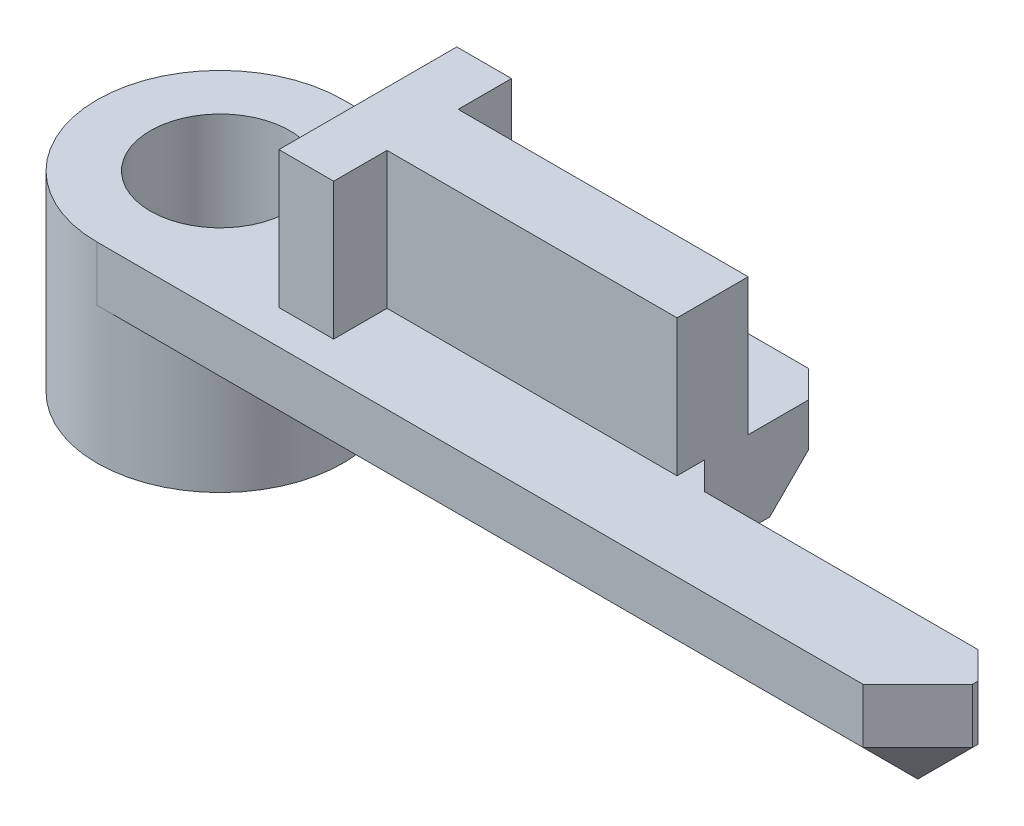
ISO-10303-21;
HEADER;
FILE_DESCRIPTION(('STEP AP214'),'2;1');
FILE_NAME('part.step','',(''),(''),'','','');
FILE_SCHEMA(('AUTOMOTIVE_DESIGN { 1 0 10303 214 1 1 1 1 }'));
ENDSEC;
DATA;
#1=APPLICATION_CONTEXT('core data for automotive mechanical design processes');
#2=APPLICATION_PROTOCOL_DEFINITION('international standard','automotive_design',2000,#1);
#3=PRODUCT_CONTEXT('',#1,'mechanical');
#4=PRODUCT('Part','Part','',(#3));
#5=PRODUCT_RELATED_PRODUCT_CATEGORY('part','',(#4));
#6=PRODUCT_DEFINITION_FORMATION('','',#4);
#7=PRODUCT_DEFINITION_CONTEXT('part definition',#1,'design');
#8=PRODUCT_DEFINITION('design','',#6,#7);
#9=PRODUCT_DEFINITION_SHAPE('','',#8);
#10=(LENGTH_UNIT() NAMED_UNIT(*) SI_UNIT(.MILLI.,.METRE.));
#11=(NAMED_UNIT(*) PLANE_ANGLE_UNIT() SI_UNIT($,.RADIAN.));
#12=(NAMED_UNIT(*) SI_UNIT($,.STERADIAN.) SOLID_ANGLE_UNIT());
#13=UNCERTAINTY_MEASURE_WITH_UNIT(LENGTH_MEASURE(1.E-05),#10,'distance_accuracy_value','');
#14=(GEOMETRIC_REPRESENTATION_CONTEXT(3) GLOBAL_UNCERTAINTY_ASSIGNED_CONTEXT((#13)) GLOBAL_UNIT_ASSIGNED_CONTEXT((#10,
#11,#12)) REPRESENTATION_CONTEXT('',''));
#15=CARTESIAN_POINT('',(0.,0.,0.));
#16=DIRECTION('',(0.,0.,1.));
#17=DIRECTION('',(1.,0.,0.));
#18=AXIS2_PLACEMENT_3D('',#15,#16,#17);
#19=CARTESIAN_POINT('',(0.,3.,0.));
#20=DIRECTION('',(0.,1.,0.));
#21=DIRECTION('',(0.,0.,1.));
#22=AXIS2_PLACEMENT_3D('',#19,#20,#21);
#23=PLANE('',#22);
#24=DIRECTION('',(1.,0.,0.));
#25=VECTOR('',#24,1.);
#26=CARTESIAN_POINT('',(0.,3.,-2.5));
#27=LINE('',#26,#25);
#28=CARTESIAN_POINT('',(3.74165738677394,3.,-2.5));
#29=VERTEX_POINT('',#28);
#30=CARTESIAN_POINT('',(17.,3.,-2.5));
#31=VERTEX_POINT('',#30);
#32=EDGE_CURVE('E354',#29,#31,#27,.T.);
#33=ORIENTED_EDGE('',*,*,#32,.T.);
#34=DIRECTION('',(0.,0.,1.));
#35=VECTOR('',#34,1.);
#36=CARTESIAN_POINT('',(17.,3.,1.3));
#37=LINE('',#36,#35);
#38=CARTESIAN_POINT('',(17.,3.,0.300000000000006));
#39=VERTEX_POINT('',#38);
#40=EDGE_CURVE('E430',#31,#39,#37,.T.);
#41=ORIENTED_EDGE('',*,*,#40,.T.);
#42=DIRECTION('',(-0.707106781186552,0.,-0.707106781186543));
#43=VECTOR('',#42,1.);
#44=CARTESIAN_POINT('',(17.,3.,0.300000000000007));
#45=LINE('',#44,#43);
#46=CARTESIAN_POINT('',(18.,3.,1.3));
#47=VERTEX_POINT('',#46);
#48=EDGE_CURVE('E426',#47,#39,#45,.T.);
#49=ORIENTED_EDGE('',*,*,#48,.F.);
#50=DIRECTION('',(-0.707106781186552,0.,-0.707106781186543));
#51=VECTOR('',#50,1.);
#52=CARTESIAN_POINT('',(17.,3.,0.300000000000007));
#53=LINE('',#52,#51);
#54=CARTESIAN_POINT('',(19.,3.,2.29999999999999));
#55=VERTEX_POINT('',#54);
#56=EDGE_CURVE('E422',#55,#47,#53,.T.);
#57=ORIENTED_EDGE('',*,*,#56,.F.);
#58=DIRECTION('',(1.,0.,0.));
#59=VECTOR('',#58,1.);
#60=CARTESIAN_POINT('',(28.,3.,2.29999999999999));
#61=LINE('',#60,#59);
#62=CARTESIAN_POINT('',(28.,3.,2.29999999999999));
#63=VERTEX_POINT('',#62);
#64=EDGE_CURVE('E419',#55,#63,#61,.T.);
#65=ORIENTED_EDGE('',*,*,#64,.T.);
#66=DIRECTION('',(0.,0.,1.));
#67=VECTOR('',#66,1.);
#68=CARTESIAN_POINT('',(28.,3.,0.));
#69=LINE('',#68,#67);
#70=CARTESIAN_POINT('',(28.,3.,2.5));
#71=VERTEX_POINT('',#70);
#72=EDGE_CURVE('E358',#63,#71,#69,.T.);
#73=ORIENTED_EDGE('',*,*,#72,.T.);
#74=DIRECTION('',(-1.,0.,0.));
#75=VECTOR('',#74,1.);
#76=CARTESIAN_POINT('',(0.,3.,2.5));
#77=LINE('',#76,#75);
#78=CARTESIAN_POINT('',(3.74165738677394,3.,2.5));
#79=VERTEX_POINT('',#78);
#80=EDGE_CURVE('E361',#71,#79,#77,.T.);
#81=ORIENTED_EDGE('',*,*,#80,.T.);
#82=CARTESIAN_POINT('',(0.,3.,0.));
#83=DIRECTION('',(0.,1.,0.));
#84=DIRECTION('',(0.,0.,1.));
#85=AXIS2_PLACEMENT_3D('',#82,#83,#84);
#86=CIRCLE('',#85,4.5);
#87=EDGE_CURVE('E340',#79,#29,#86,.T.);
#88=ORIENTED_EDGE('',*,*,#87,.T.);
#89=EDGE_LOOP('',(#33,#41,#49,#57,#65,#73,#81,#88));
#90=FACE_BOUND('',#89,.T.);
#91=ADVANCED_FACE('F45',(#90),#23,.F.);
#92=CARTESIAN_POINT('',(0.,6.99999999999999,0.));
#93=DIRECTION('',(0.,1.,0.));
#94=DIRECTION('',(0.,0.,1.));
#95=AXIS2_PLACEMENT_3D('',#92,#93,#94);
#96=PLANE('',#95);
#97=CARTESIAN_POINT('',(0.,6.99999999999999,0.));
#98=DIRECTION('',(0.,1.,0.));
#99=DIRECTION('',(0.,0.,1.));
#100=AXIS2_PLACEMENT_3D('',#97,#98,#99);
#101=CIRCLE('',#100,2.55);
#102=CARTESIAN_POINT('',(0.,6.99999999999999,2.55));
#103=VERTEX_POINT('',#102);
#104=EDGE_CURVE('E307',#103,#103,#101,.T.);
#105=ORIENTED_EDGE('',*,*,#104,.F.);
#106=EDGE_LOOP('',(#105));
#107=FACE_BOUND('',#106,.T.);
#108=DIRECTION('',(0.,0.,-1.));
#109=VECTOR('',#108,1.);
#110=CARTESIAN_POINT('',(18.,6.99999999999999,0.));
#111=LINE('',#110,#109);
#112=CARTESIAN_POINT('',(18.,6.99999999999999,-1.3));
#113=VERTEX_POINT('',#112);
#114=CARTESIAN_POINT('',(18.,6.99999999999999,-3.5));
#115=VERTEX_POINT('',#114);
#116=EDGE_CURVE('E302',#113,#115,#111,.T.);
#117=ORIENTED_EDGE('',*,*,#116,.T.);
#118=DIRECTION('',(-0.707106781186547,0.,-0.707106781186549));
#119=VECTOR('',#118,1.);
#120=CARTESIAN_POINT('',(10.75,6.99999999999999,-10.75));
#121=LINE('',#120,#119);
#122=CARTESIAN_POINT('',(17.,6.99999999999999,-4.5));
#123=VERTEX_POINT('',#122);
#124=EDGE_CURVE('E410',#115,#123,#121,.T.);
#125=ORIENTED_EDGE('',*,*,#124,.T.);
#126=DIRECTION('',(-1.,0.,0.));
#127=VECTOR('',#126,1.);
#128=CARTESIAN_POINT('',(0.,6.99999999999999,-4.5));
#129=LINE('',#128,#127);
#130=CARTESIAN_POINT('',(0.,6.99999999999999,-4.5));
#131=VERTEX_POINT('',#130);
#132=EDGE_CURVE('E324',#123,#131,#129,.T.);
#133=ORIENTED_EDGE('',*,*,#132,.T.);
#134=CARTESIAN_POINT('',(0.,6.99999999999999,0.));
#135=DIRECTION('',(0.,1.,0.));
#136=DIRECTION('',(0.,0.,1.));
#137=AXIS2_PLACEMENT_3D('',#134,#135,#136);
#138=CIRCLE('',#137,4.5);
#139=CARTESIAN_POINT('',(0.,6.99999999999999,4.5));
#140=VERTEX_POINT('',#139);
#141=EDGE_CURVE('E311',#131,#140,#138,.T.);
#142=ORIENTED_EDGE('',*,*,#141,.T.);
#143=DIRECTION('',(1.,0.,0.));
#144=VECTOR('',#143,1.);
#145=CARTESIAN_POINT('',(0.,6.99999999999999,4.5));
#146=LINE('',#145,#144);
#147=CARTESIAN_POINT('',(28.,6.99999999999999,4.5));
#148=VERTEX_POINT('',#147);
#149=EDGE_CURVE('E316',#140,#148,#146,.T.);
#150=ORIENTED_EDGE('',*,*,#149,.T.);
#151=DIRECTION('',(-0.707106781186549,0.,0.707106781186546));
#152=VECTOR('',#151,1.);
#153=CARTESIAN_POINT('',(16.2499999999999,6.99999999999999,16.25));
#154=LINE('',#153,#152);
#155=CARTESIAN_POINT('',(30.,6.99999999999999,2.5));
#156=VERTEX_POINT('',#155);
#157=EDGE_CURVE('E371',#148,#156,#154,.F.);
#158=ORIENTED_EDGE('',*,*,#157,.T.);
#159=DIRECTION('',(0.,0.,-1.));
#160=VECTOR('',#159,1.);
#161=CARTESIAN_POINT('',(30.,6.99999999999999,4.5));
#162=LINE('',#161,#160);
#163=CARTESIAN_POINT('',(30.,6.99999999999999,2.29999999999999));
#164=VERTEX_POINT('',#163);
#165=EDGE_CURVE('E320',#156,#164,#162,.T.);
#166=ORIENTED_EDGE('',*,*,#165,.T.);
#167=DIRECTION('',(-0.707106781186552,0.,-0.707106781186543));
#168=VECTOR('',#167,1.);
#169=CARTESIAN_POINT('',(13.8499999999998,6.99999999999999,-13.85));
#170=LINE('',#169,#168);
#171=CARTESIAN_POINT('',(29.,6.99999999999999,1.3));
#172=VERTEX_POINT('',#171);
#173=EDGE_CURVE('E407',#164,#172,#170,.T.);
#174=ORIENTED_EDGE('',*,*,#173,.T.);
#175=DIRECTION('',(-1.,0.,0.));
#176=VECTOR('',#175,1.);
#177=CARTESIAN_POINT('',(0.,6.99999999999999,1.3));
#178=LINE('',#177,#176);
#179=CARTESIAN_POINT('',(19.,6.99999999999999,1.3));
#180=VERTEX_POINT('',#179);
#181=EDGE_CURVE('E215',#172,#180,#178,.T.);
#182=ORIENTED_EDGE('',*,*,#181,.T.);
#183=DIRECTION('',(0.707106781186552,0.,0.707106781186543));
#184=VECTOR('',#183,1.);
#185=CARTESIAN_POINT('',(19.,6.99999999999999,1.3));
#186=LINE('',#185,#184);
#187=CARTESIAN_POINT('',(18.,6.99999999999999,0.300000000000006));
#188=VERTEX_POINT('',#187);
#189=EDGE_CURVE('E11',#180,#188,#186,.F.);
#190=ORIENTED_EDGE('',*,*,#189,.T.);
#191=DIRECTION('',(0.,0.,-1.));
#192=VECTOR('',#191,1.);
#193=CARTESIAN_POINT('',(18.,6.99999999999999,0.));
#194=LINE('',#193,#192);
#195=CARTESIAN_POINT('',(18.,6.99999999999999,1.3));
#196=VERTEX_POINT('',#195);
#197=EDGE_CURVE('E63',#196,#188,#194,.T.);
#198=ORIENTED_EDGE('',*,*,#197,.F.);
#199=DIRECTION('',(1.,0.,0.));
#200=VECTOR('',#199,1.);
#201=CARTESIAN_POINT('',(0.,6.99999999999999,1.3));
#202=LINE('',#201,#200);
#203=CARTESIAN_POINT('',(7.4,6.99999999999999,1.3));
#204=VERTEX_POINT('',#203);
#205=EDGE_CURVE('E233',#204,#196,#202,.T.);
#206=ORIENTED_EDGE('',*,*,#205,.F.);
#207=DIRECTION('',(0.,0.,-1.));
#208=VECTOR('',#207,1.);
#209=CARTESIAN_POINT('',(7.4,6.99999999999999,0.));
#210=LINE('',#209,#208);
#211=CARTESIAN_POINT('',(7.4,6.99999999999999,3.25));
#212=VERTEX_POINT('',#211);
#213=EDGE_CURVE('E237',#212,#204,#210,.T.);
#214=ORIENTED_EDGE('',*,*,#213,.F.);
#215=DIRECTION('',(1.,0.,0.));
#216=VECTOR('',#215,1.);
#217=CARTESIAN_POINT('',(0.,6.99999999999999,3.25));
#218=LINE('',#217,#216);
#219=CARTESIAN_POINT('',(5.4,6.99999999999999,3.25));
#220=VERTEX_POINT('',#219);
#221=EDGE_CURVE('E269',#220,#212,#218,.T.);
#222=ORIENTED_EDGE('',*,*,#221,.F.);
#223=DIRECTION('',(0.,0.,-1.));
#224=VECTOR('',#223,1.);
#225=CARTESIAN_POINT('',(5.4,6.99999999999999,0.));
#226=LINE('',#225,#224);
#227=CARTESIAN_POINT('',(5.4,6.99999999999999,-3.25));
#228=VERTEX_POINT('',#227);
#229=EDGE_CURVE('E266',#220,#228,#226,.T.);
#230=ORIENTED_EDGE('',*,*,#229,.T.);
#231=DIRECTION('',(1.,0.,0.));
#232=VECTOR('',#231,1.);
#233=CARTESIAN_POINT('',(0.,6.99999999999999,-3.25));
#234=LINE('',#233,#232);
#235=CARTESIAN_POINT('',(7.4,6.99999999999999,-3.25));
#236=VERTEX_POINT('',#235);
#237=EDGE_CURVE('E263',#228,#236,#234,.T.);
#238=ORIENTED_EDGE('',*,*,#237,.T.);
#239=DIRECTION('',(0.,0.,-1.));
#240=VECTOR('',#239,1.);
#241=CARTESIAN_POINT('',(7.4,6.99999999999999,0.));
#242=LINE('',#241,#240);
#243=CARTESIAN_POINT('',(7.4,6.99999999999999,-1.3));
#244=VERTEX_POINT('',#243);
#245=EDGE_CURVE('E260',#244,#236,#242,.T.);
#246=ORIENTED_EDGE('',*,*,#245,.F.);
#247=DIRECTION('',(1.,0.,0.));
#248=VECTOR('',#247,1.);
#249=CARTESIAN_POINT('',(0.,6.99999999999999,-1.3));
#250=LINE('',#249,#248);
#251=EDGE_CURVE('E211',#244,#113,#250,.T.);
#252=ORIENTED_EDGE('',*,*,#251,.T.);
#253=EDGE_LOOP('',(#117,#125,#133,#142,#150,#158,#166,#174,#182,#190,#198,#206,#214,#222,#230,
#238,#246,#252));
#254=FACE_BOUND('',#253,.T.);
#255=ADVANCED_FACE('F489',(#107,#254),#96,.T.);
#256=CARTESIAN_POINT('',(30.,6.99999999999999,4.5));
#257=DIRECTION('',(-1.,0.,0.));
#258=DIRECTION('',(0.,0.,1.));
#259=AXIS2_PLACEMENT_3D('',#256,#257,#258);
#260=PLANE('',#259);
#261=DIRECTION('',(0.,0.,-1.));
#262=VECTOR('',#261,1.);
#263=CARTESIAN_POINT('',(30.,5.,4.5));
#264=LINE('',#263,#262);
#265=CARTESIAN_POINT('',(30.,5.,2.5));
#266=VERTEX_POINT('',#265);
#267=CARTESIAN_POINT('',(30.,5.,2.29999999999999));
#268=VERTEX_POINT('',#267);
#269=EDGE_CURVE('E364',#266,#268,#264,.T.);
#270=ORIENTED_EDGE('',*,*,#269,.T.);
#271=DIRECTION('',(0.,1.,0.));
#272=VECTOR('',#271,1.);
#273=CARTESIAN_POINT('',(30.,6.99999999999999,2.29999999999999));
#274=LINE('',#273,#272);
#275=EDGE_CURVE('E433',#268,#164,#274,.T.);
#276=ORIENTED_EDGE('',*,*,#275,.T.);
#277=ORIENTED_EDGE('',*,*,#165,.F.);
#278=DIRECTION('',(0.,-1.,0.));
#279=VECTOR('',#278,1.);
#280=CARTESIAN_POINT('',(30.,6.99999999999999,2.5));
#281=LINE('',#280,#279);
#282=EDGE_CURVE('E368',#156,#266,#281,.T.);
#283=ORIENTED_EDGE('',*,*,#282,.T.);
#284=EDGE_LOOP('',(#270,#276,#277,#283));
#285=FACE_BOUND('',#284,.T.);
#286=ADVANCED_FACE('F486',(#285),#260,.F.);
#287=CARTESIAN_POINT('',(0.,6.99999999999999,-4.5));
#288=DIRECTION('',(0.,0.,1.));
#289=DIRECTION('',(1.,0.,0.));
#290=AXIS2_PLACEMENT_3D('',#287,#288,#289);
#291=PLANE('',#290);
#292=ORIENTED_EDGE('',*,*,#132,.F.);
#293=DIRECTION('',(0.,-1.,0.));
#294=VECTOR('',#293,1.);
#295=CARTESIAN_POINT('',(17.,5.00000000000001,-4.5));
#296=LINE('',#295,#294);
#297=CARTESIAN_POINT('',(17.,5.00000000000001,-4.5));
#298=VERTEX_POINT('',#297);
#299=EDGE_CURVE('E413',#123,#298,#296,.T.);
#300=ORIENTED_EDGE('',*,*,#299,.T.);
#301=DIRECTION('',(-1.,0.,0.));
#302=VECTOR('',#301,1.);
#303=CARTESIAN_POINT('',(0.,5.00000000000001,-4.5));
#304=LINE('',#303,#302);
#305=CARTESIAN_POINT('',(0.,5.00000000000001,-4.5));
#306=VERTEX_POINT('',#305);
#307=EDGE_CURVE('E374',#298,#306,#304,.T.);
#308=ORIENTED_EDGE('',*,*,#307,.T.);
#309=DIRECTION('',(0.,-1.,0.));
#310=VECTOR('',#309,1.);
#311=CARTESIAN_POINT('',(0.,6.99999999999999,-4.5));
#312=LINE('',#311,#310);
#313=EDGE_CURVE('E327',#131,#306,#312,.T.);
#314=ORIENTED_EDGE('',*,*,#313,.F.);
#315=EDGE_LOOP('',(#292,#300,#308,#314));
#316=FACE_BOUND('',#315,.T.);
#317=ADVANCED_FACE('F546',(#316),#291,.F.);
#318=CARTESIAN_POINT('',(0.,5.00000000000001,-4.5));
#319=DIRECTION('',(0.,0.707106781186546,0.707106781186549));
#320=DIRECTION('',(-1.,0.,0.));
#321=AXIS2_PLACEMENT_3D('',#318,#319,#320);
#322=PLANE('',#321);
#323=ORIENTED_EDGE('',*,*,#307,.F.);
#324=DIRECTION('',(0.,0.707106781186549,-0.707106781186546));
#325=VECTOR('',#324,1.);
#326=CARTESIAN_POINT('',(17.,5.00000000000001,-4.5));
#327=LINE('',#326,#325);
#328=EDGE_CURVE('E416',#298,#31,#327,.F.);
#329=ORIENTED_EDGE('',*,*,#328,.T.);
#330=ORIENTED_EDGE('',*,*,#32,.F.);
#331=CARTESIAN_POINT('',(0.,0.49999999999999,0.));
#332=DIRECTION('',(0.,0.707106781186546,0.707106781186549));
#333=DIRECTION('',(0.,-0.707106781186549,0.707106781186546));
#334=AXIS2_PLACEMENT_3D('',#331,#332,#333);
#335=ELLIPSE('',#334,6.36396103067894,4.5);
#336=EDGE_CURVE('E380',#306,#29,#335,.F.);
#337=ORIENTED_EDGE('',*,*,#336,.F.);
#338=EDGE_LOOP('',(#323,#329,#330,#337));
#339=FACE_BOUND('',#338,.T.);
#340=ADVANCED_FACE('F585',(#339),#322,.F.);
#341=CARTESIAN_POINT('',(30.,5.,4.5));
#342=DIRECTION('',(-0.707106781186546,0.707106781186549,0.));
#343=DIRECTION('',(0.,0.,-1.));
#344=AXIS2_PLACEMENT_3D('',#341,#342,#343);
#345=PLANE('',#344);
#346=ORIENTED_EDGE('',*,*,#72,.F.);
#347=DIRECTION('',(-0.707106781186549,-0.707106781186546,0.));
#348=VECTOR('',#347,1.);
#349=CARTESIAN_POINT('',(30.,5.,2.29999999999999));
#350=LINE('',#349,#348);
#351=EDGE_CURVE('E56',#63,#268,#350,.F.);
#352=ORIENTED_EDGE('',*,*,#351,.T.);
#353=ORIENTED_EDGE('',*,*,#269,.F.);
#354=DIRECTION('',(-0.707106781186549,-0.707106781186546,0.));
#355=VECTOR('',#354,1.);
#356=CARTESIAN_POINT('',(29.,4.,2.5));
#357=LINE('',#356,#355);
#358=EDGE_CURVE('E386',#71,#266,#357,.F.);
#359=ORIENTED_EDGE('',*,*,#358,.F.);
#360=EDGE_LOOP('',(#346,#352,#353,#359));
#361=FACE_BOUND('',#360,.T.);
#362=ADVANCED_FACE('F498',(#361),#345,.F.);
#363=CARTESIAN_POINT('',(0.,0.,0.));
#364=DIRECTION('',(0.,1.,0.));
#365=DIRECTION('',(0.,0.,1.));
#366=AXIS2_PLACEMENT_3D('',#363,#364,#365);
#367=PLANE('',#366);
#368=CARTESIAN_POINT('',(0.,0.,0.));
#369=DIRECTION('',(0.,1.,0.));
#370=DIRECTION('',(0.,0.,1.));
#371=AXIS2_PLACEMENT_3D('',#368,#369,#370);
#372=CIRCLE('',#371,4.5);
#373=CARTESIAN_POINT('',(0.,0.,4.5));
#374=VERTEX_POINT('',#373);
#375=EDGE_CURVE('E339',#374,#374,#372,.T.);
#376=ORIENTED_EDGE('',*,*,#375,.F.);
#377=EDGE_LOOP('',(#376));
#378=FACE_BOUND('',#377,.T.);
#379=CARTESIAN_POINT('',(0.,0.,0.));
#380=DIRECTION('',(0.,1.,0.));
#381=DIRECTION('',(0.,0.,1.));
#382=AXIS2_PLACEMENT_3D('',#379,#380,#381);
#383=CIRCLE('',#382,2.55);
#384=CARTESIAN_POINT('',(0.,0.,2.55));
#385=VERTEX_POINT('',#384);
#386=EDGE_CURVE('E335',#385,#385,#383,.T.);
#387=ORIENTED_EDGE('',*,*,#386,.T.);
#388=EDGE_LOOP('',(#387));
#389=FACE_BOUND('',#388,.T.);
#390=ADVANCED_FACE('F594',(#378,#389),#367,.F.);
#391=CARTESIAN_POINT('',(0.,3.,0.));
#392=DIRECTION('',(0.,-1.,0.));
#393=DIRECTION('',(0.,0.,-1.));
#394=AXIS2_PLACEMENT_3D('',#391,#392,#393);
#395=CYLINDRICAL_SURFACE('',#394,4.5);
#396=ORIENTED_EDGE('',*,*,#87,.F.);
#397=CARTESIAN_POINT('',(0.,0.49999999999999,0.));
#398=DIRECTION('',(0.,0.707106781186546,-0.707106781186549));
#399=DIRECTION('',(0.,-0.707106781186549,-0.707106781186546));
#400=AXIS2_PLACEMENT_3D('',#397,#398,#399);
#401=ELLIPSE('',#400,6.36396103067894,4.5);
#402=CARTESIAN_POINT('',(0.,5.00000000000001,4.5));
#403=VERTEX_POINT('',#402);
#404=EDGE_CURVE('E377',#79,#403,#401,.F.);
#405=ORIENTED_EDGE('',*,*,#404,.T.);
#406=DIRECTION('',(0.,-1.,0.));
#407=VECTOR('',#406,1.);
#408=CARTESIAN_POINT('',(0.,6.99999999999999,4.5));
#409=LINE('',#408,#407);
#410=EDGE_CURVE('E331',#140,#403,#409,.T.);
#411=ORIENTED_EDGE('',*,*,#410,.F.);
#412=ORIENTED_EDGE('',*,*,#141,.F.);
#413=ORIENTED_EDGE('',*,*,#313,.T.);
#414=ORIENTED_EDGE('',*,*,#336,.T.);
#415=EDGE_LOOP('',(#396,#405,#411,#412,#413,#414));
#416=FACE_BOUND('',#415,.T.);
#417=ORIENTED_EDGE('',*,*,#375,.T.);
#418=EDGE_LOOP('',(#417));
#419=FACE_BOUND('',#418,.T.);
#420=ADVANCED_FACE('F552',(#416,#419),#395,.T.);
#421=CARTESIAN_POINT('',(0.,3.,0.));
#422=DIRECTION('',(0.,-1.,0.));
#423=DIRECTION('',(0.,0.,-1.));
#424=AXIS2_PLACEMENT_3D('',#421,#422,#423);
#425=CYLINDRICAL_SURFACE('',#424,2.55);
#426=ORIENTED_EDGE('',*,*,#386,.F.);
#427=EDGE_LOOP('',(#426));
#428=FACE_BOUND('',#427,.T.);
#429=ORIENTED_EDGE('',*,*,#104,.T.);
#430=EDGE_LOOP('',(#429));
#431=FACE_BOUND('',#430,.T.);
#432=ADVANCED_FACE('F590',(#428,#431),#425,.F.);
#433=CARTESIAN_POINT('',(0.,6.99999999999999,4.5));
#434=DIRECTION('',(0.,0.,-1.));
#435=DIRECTION('',(-1.,0.,0.));
#436=AXIS2_PLACEMENT_3D('',#433,#434,#435);
#437=PLANE('',#436);
#438=ORIENTED_EDGE('',*,*,#410,.T.);
#439=DIRECTION('',(1.,0.,0.));
#440=VECTOR('',#439,1.);
#441=CARTESIAN_POINT('',(0.,5.00000000000001,4.5));
#442=LINE('',#441,#440);
#443=CARTESIAN_POINT('',(28.,5.00000000000001,4.5));
#444=VERTEX_POINT('',#443);
#445=EDGE_CURVE('E350',#403,#444,#442,.T.);
#446=ORIENTED_EDGE('',*,*,#445,.T.);
#447=DIRECTION('',(0.,1.,0.));
#448=VECTOR('',#447,1.);
#449=CARTESIAN_POINT('',(28.,6.99999999999999,4.5));
#450=LINE('',#449,#448);
#451=EDGE_CURVE('E344',#444,#148,#450,.T.);
#452=ORIENTED_EDGE('',*,*,#451,.T.);
#453=ORIENTED_EDGE('',*,*,#149,.F.);
#454=EDGE_LOOP('',(#438,#446,#452,#453));
#455=FACE_BOUND('',#454,.T.);
#456=ADVANCED_FACE('F557',(#455),#437,.F.);
#457=CARTESIAN_POINT('',(30.,6.99999999999999,2.5));
#458=DIRECTION('',(-0.707106781186546,0.,-0.707106781186549));
#459=DIRECTION('',(0.,-1.,0.));
#460=AXIS2_PLACEMENT_3D('',#457,#458,#459);
#461=PLANE('',#460);
#462=ORIENTED_EDGE('',*,*,#157,.F.);
#463=ORIENTED_EDGE('',*,*,#451,.F.);
#464=DIRECTION('',(0.707106781186549,0.,-0.707106781186546));
#465=VECTOR('',#464,1.);
#466=CARTESIAN_POINT('',(28.,5.00000000000001,4.5));
#467=LINE('',#466,#465);
#468=EDGE_CURVE('E312',#266,#444,#467,.F.);
#469=ORIENTED_EDGE('',*,*,#468,.F.);
#470=ORIENTED_EDGE('',*,*,#282,.F.);
#471=EDGE_LOOP('',(#462,#463,#469,#470));
#472=FACE_BOUND('',#471,.T.);
#473=ADVANCED_FACE('F493',(#472),#461,.F.);
#474=CARTESIAN_POINT('',(28.,5.00000000000001,4.5));
#475=DIRECTION('',(0.577350269189623,-0.577350269189626,0.577350269189629));
#476=DIRECTION('',(0.,-0.707106781186549,-0.707106781186546));
#477=AXIS2_PLACEMENT_3D('',#474,#475,#476);
#478=PLANE('',#477);
#479=ORIENTED_EDGE('',*,*,#358,.T.);
#480=ORIENTED_EDGE('',*,*,#468,.T.);
#481=DIRECTION('',(0.,0.707106781186549,0.707106781186546));
#482=VECTOR('',#481,1.);
#483=CARTESIAN_POINT('',(28.,5.00000000000001,4.5));
#484=LINE('',#483,#482);
#485=EDGE_CURVE('E306',#71,#444,#484,.T.);
#486=ORIENTED_EDGE('',*,*,#485,.F.);
#487=EDGE_LOOP('',(#479,#480,#486));
#488=FACE_BOUND('',#487,.T.);
#489=ADVANCED_FACE('F562',(#488),#478,.T.);
#490=CARTESIAN_POINT('',(0.,5.00000000000001,4.5));
#491=DIRECTION('',(0.,0.707106781186546,-0.707106781186549));
#492=DIRECTION('',(1.,0.,0.));
#493=AXIS2_PLACEMENT_3D('',#490,#491,#492);
#494=PLANE('',#493);
#495=ORIENTED_EDGE('',*,*,#404,.F.);
#496=ORIENTED_EDGE('',*,*,#80,.F.);
#497=ORIENTED_EDGE('',*,*,#485,.T.);
#498=ORIENTED_EDGE('',*,*,#445,.F.);
#499=EDGE_LOOP('',(#495,#496,#497,#498));
#500=FACE_BOUND('',#499,.T.);
#501=ADVANCED_FACE('F559',(#500),#494,.F.);
#502=CARTESIAN_POINT('',(18.,0.,0.));
#503=DIRECTION('',(1.,0.,0.));
#504=DIRECTION('',(0.,0.,-1.));
#505=AXIS2_PLACEMENT_3D('',#502,#503,#504);
#506=PLANE('',#505);
#507=DIRECTION('',(0.,0.707106781186549,-0.707106781186546));
#508=VECTOR('',#507,1.);
#509=CARTESIAN_POINT('',(18.,0.957106781186542,0.957106781186547));
#510=LINE('',#509,#508);
#511=CARTESIAN_POINT('',(18.,4.00000000000001,-2.0857864376269));
#512=VERTEX_POINT('',#511);
#513=CARTESIAN_POINT('',(18.,5.41421356237311,-3.5));
#514=VERTEX_POINT('',#513);
#515=EDGE_CURVE('E400',#512,#514,#510,.T.);
#516=ORIENTED_EDGE('',*,*,#515,.T.);
#517=DIRECTION('',(0.,1.,0.));
#518=VECTOR('',#517,1.);
#519=CARTESIAN_POINT('',(18.,6.99999999999999,-3.5));
#520=LINE('',#519,#518);
#521=EDGE_CURVE('E403',#514,#115,#520,.T.);
#522=ORIENTED_EDGE('',*,*,#521,.T.);
#523=ORIENTED_EDGE('',*,*,#116,.F.);
#524=DIRECTION('',(0.,-1.,0.));
#525=VECTOR('',#524,1.);
#526=CARTESIAN_POINT('',(18.,12.,-1.3));
#527=LINE('',#526,#525);
#528=CARTESIAN_POINT('',(18.,12.,-1.3));
#529=VERTEX_POINT('',#528);
#530=EDGE_CURVE('E257',#529,#113,#527,.T.);
#531=ORIENTED_EDGE('',*,*,#530,.F.);
#532=DIRECTION('',(0.,0.,-1.));
#533=VECTOR('',#532,1.);
#534=CARTESIAN_POINT('',(18.,12.,0.));
#535=LINE('',#534,#533);
#536=CARTESIAN_POINT('',(18.,12.,1.3));
#537=VERTEX_POINT('',#536);
#538=EDGE_CURVE('E230',#537,#529,#535,.T.);
#539=ORIENTED_EDGE('',*,*,#538,.F.);
#540=DIRECTION('',(0.,-1.,0.));
#541=VECTOR('',#540,1.);
#542=CARTESIAN_POINT('',(18.,12.,1.3));
#543=LINE('',#542,#541);
#544=EDGE_CURVE('E278',#537,#196,#543,.T.);
#545=ORIENTED_EDGE('',*,*,#544,.T.);
#546=ORIENTED_EDGE('',*,*,#197,.T.);
#547=DIRECTION('',(0.,-1.,0.));
#548=VECTOR('',#547,1.);
#549=CARTESIAN_POINT('',(18.,3.,0.300000000000006));
#550=LINE('',#549,#548);
#551=CARTESIAN_POINT('',(18.,4.00000000000001,0.300000000000006));
#552=VERTEX_POINT('',#551);
#553=EDGE_CURVE('E383',#188,#552,#550,.T.);
#554=ORIENTED_EDGE('',*,*,#553,.T.);
#555=DIRECTION('',(0.,0.,-1.));
#556=VECTOR('',#555,1.);
#557=CARTESIAN_POINT('',(18.,4.00000000000001,-2.5));
#558=LINE('',#557,#556);
#559=EDGE_CURVE('E397',#552,#512,#558,.T.);
#560=ORIENTED_EDGE('',*,*,#559,.T.);
#561=EDGE_LOOP('',(#516,#522,#523,#531,#539,#545,#546,#554,#560));
#562=FACE_BOUND('',#561,.T.);
#563=ADVANCED_FACE('F516',(#562),#506,.T.);
#564=CARTESIAN_POINT('',(0.,0.,1.3));
#565=DIRECTION('',(0.,0.,-1.));
#566=DIRECTION('',(-1.,0.,0.));
#567=AXIS2_PLACEMENT_3D('',#564,#565,#566);
#568=PLANE('',#567);
#569=ORIENTED_EDGE('',*,*,#181,.F.);
#570=DIRECTION('',(0.,-1.,0.));
#571=VECTOR('',#570,1.);
#572=CARTESIAN_POINT('',(29.,5.,1.3));
#573=LINE('',#572,#571);
#574=CARTESIAN_POINT('',(29.,5.4142135623731,1.3));
#575=VERTEX_POINT('',#574);
#576=EDGE_CURVE('E71',#172,#575,#573,.T.);
#577=ORIENTED_EDGE('',*,*,#576,.T.);
#578=DIRECTION('',(-0.707106781186549,-0.707106781186546,0.));
#579=VECTOR('',#578,1.);
#580=CARTESIAN_POINT('',(11.7928932188134,-11.7928932188134,1.3));
#581=LINE('',#580,#579);
#582=CARTESIAN_POINT('',(27.5857864376269,4.00000000000001,1.3));
#583=VERTEX_POINT('',#582);
#584=EDGE_CURVE('E442',#575,#583,#581,.T.);
#585=ORIENTED_EDGE('',*,*,#584,.T.);
#586=DIRECTION('',(-1.,0.,0.));
#587=VECTOR('',#586,1.);
#588=CARTESIAN_POINT('',(18.,4.00000000000001,1.3));
#589=LINE('',#588,#587);
#590=CARTESIAN_POINT('',(19.,4.00000000000001,1.3));
#591=VERTEX_POINT('',#590);
#592=EDGE_CURVE('E439',#583,#591,#589,.T.);
#593=ORIENTED_EDGE('',*,*,#592,.T.);
#594=DIRECTION('',(0.,1.,0.));
#595=VECTOR('',#594,1.);
#596=CARTESIAN_POINT('',(19.,6.99999999999999,1.3));
#597=LINE('',#596,#595);
#598=EDGE_CURVE('E436',#591,#180,#597,.T.);
#599=ORIENTED_EDGE('',*,*,#598,.T.);
#600=EDGE_LOOP('',(#569,#577,#585,#593,#599));
#601=FACE_BOUND('',#600,.T.);
#602=ADVANCED_FACE('F514',(#601),#568,.T.);
#603=CARTESIAN_POINT('',(0.,12.,-1.3));
#604=DIRECTION('',(0.,0.,-1.));
#605=DIRECTION('',(-1.,0.,0.));
#606=AXIS2_PLACEMENT_3D('',#603,#604,#605);
#607=PLANE('',#606);
#608=ORIENTED_EDGE('',*,*,#251,.F.);
#609=DIRECTION('',(0.,-1.,0.));
#610=VECTOR('',#609,1.);
#611=CARTESIAN_POINT('',(7.4,12.,-1.3));
#612=LINE('',#611,#610);
#613=CARTESIAN_POINT('',(7.4,12.,-1.3));
#614=VERTEX_POINT('',#613);
#615=EDGE_CURVE('E205',#614,#244,#612,.T.);
#616=ORIENTED_EDGE('',*,*,#615,.F.);
#617=DIRECTION('',(1.,0.,0.));
#618=VECTOR('',#617,1.);
#619=CARTESIAN_POINT('',(0.,12.,-1.3));
#620=LINE('',#619,#618);
#621=EDGE_CURVE('E210',#614,#529,#620,.T.);
#622=ORIENTED_EDGE('',*,*,#621,.T.);
#623=ORIENTED_EDGE('',*,*,#530,.T.);
#624=EDGE_LOOP('',(#608,#616,#622,#623));
#625=FACE_BOUND('',#624,.T.);
#626=ADVANCED_FACE('F207',(#625),#607,.T.);
#627=CARTESIAN_POINT('',(7.4,12.,0.));
#628=DIRECTION('',(-1.,0.,0.));
#629=DIRECTION('',(0.,0.,1.));
#630=AXIS2_PLACEMENT_3D('',#627,#628,#629);
#631=PLANE('',#630);
#632=ORIENTED_EDGE('',*,*,#245,.T.);
#633=DIRECTION('',(0.,-1.,0.));
#634=VECTOR('',#633,1.);
#635=CARTESIAN_POINT('',(7.4,12.,-3.25));
#636=LINE('',#635,#634);
#637=CARTESIAN_POINT('',(7.4,12.,-3.25));
#638=VERTEX_POINT('',#637);
#639=EDGE_CURVE('E216',#638,#236,#636,.T.);
#640=ORIENTED_EDGE('',*,*,#639,.F.);
#641=DIRECTION('',(0.,0.,-1.));
#642=VECTOR('',#641,1.);
#643=CARTESIAN_POINT('',(7.4,12.,0.));
#644=LINE('',#643,#642);
#645=EDGE_CURVE('E219',#614,#638,#644,.T.);
#646=ORIENTED_EDGE('',*,*,#645,.F.);
#647=ORIENTED_EDGE('',*,*,#615,.T.);
#648=EDGE_LOOP('',(#632,#640,#646,#647));
#649=FACE_BOUND('',#648,.T.);
#650=ADVANCED_FACE('F220',(#649),#631,.F.);
#651=CARTESIAN_POINT('',(0.,12.,-3.25));
#652=DIRECTION('',(0.,0.,-1.));
#653=DIRECTION('',(-1.,0.,0.));
#654=AXIS2_PLACEMENT_3D('',#651,#652,#653);
#655=PLANE('',#654);
#656=ORIENTED_EDGE('',*,*,#237,.F.);
#657=DIRECTION('',(0.,-1.,0.));
#658=VECTOR('',#657,1.);
#659=CARTESIAN_POINT('',(5.4,12.,-3.25));
#660=LINE('',#659,#658);
#661=CARTESIAN_POINT('',(5.4,12.,-3.25));
#662=VERTEX_POINT('',#661);
#663=EDGE_CURVE('E293',#662,#228,#660,.T.);
#664=ORIENTED_EDGE('',*,*,#663,.F.);
#665=DIRECTION('',(1.,0.,0.));
#666=VECTOR('',#665,1.);
#667=CARTESIAN_POINT('',(0.,12.,-3.25));
#668=LINE('',#667,#666);
#669=EDGE_CURVE('E226',#662,#638,#668,.T.);
#670=ORIENTED_EDGE('',*,*,#669,.T.);
#671=ORIENTED_EDGE('',*,*,#639,.T.);
#672=EDGE_LOOP('',(#656,#664,#670,#671));
#673=FACE_BOUND('',#672,.T.);
#674=ADVANCED_FACE('F535',(#673),#655,.T.);
#675=CARTESIAN_POINT('',(5.4,12.,0.));
#676=DIRECTION('',(-1.,0.,0.));
#677=DIRECTION('',(0.,0.,1.));
#678=AXIS2_PLACEMENT_3D('',#675,#676,#677);
#679=PLANE('',#678);
#680=ORIENTED_EDGE('',*,*,#229,.F.);
#681=DIRECTION('',(0.,-1.,0.));
#682=VECTOR('',#681,1.);
#683=CARTESIAN_POINT('',(5.4,12.,3.25));
#684=LINE('',#683,#682);
#685=CARTESIAN_POINT('',(5.4,12.,3.25));
#686=VERTEX_POINT('',#685);
#687=EDGE_CURVE('E289',#686,#220,#684,.T.);
#688=ORIENTED_EDGE('',*,*,#687,.F.);
#689=DIRECTION('',(0.,0.,-1.));
#690=VECTOR('',#689,1.);
#691=CARTESIAN_POINT('',(5.4,12.,0.));
#692=LINE('',#691,#690);
#693=EDGE_CURVE('E242',#686,#662,#692,.T.);
#694=ORIENTED_EDGE('',*,*,#693,.T.);
#695=ORIENTED_EDGE('',*,*,#663,.T.);
#696=EDGE_LOOP('',(#680,#688,#694,#695));
#697=FACE_BOUND('',#696,.T.);
#698=ADVANCED_FACE('F533',(#697),#679,.T.);
#699=CARTESIAN_POINT('',(0.,12.,3.25));
#700=DIRECTION('',(0.,0.,-1.));
#701=DIRECTION('',(-1.,0.,0.));
#702=AXIS2_PLACEMENT_3D('',#699,#700,#701);
#703=PLANE('',#702);
#704=ORIENTED_EDGE('',*,*,#221,.T.);
#705=DIRECTION('',(0.,-1.,0.));
#706=VECTOR('',#705,1.);
#707=CARTESIAN_POINT('',(7.4,12.,3.25));
#708=LINE('',#707,#706);
#709=CARTESIAN_POINT('',(7.4,12.,3.25));
#710=VERTEX_POINT('',#709);
#711=EDGE_CURVE('E285',#710,#212,#708,.T.);
#712=ORIENTED_EDGE('',*,*,#711,.F.);
#713=DIRECTION('',(1.,0.,0.));
#714=VECTOR('',#713,1.);
#715=CARTESIAN_POINT('',(0.,12.,3.25));
#716=LINE('',#715,#714);
#717=EDGE_CURVE('E246',#686,#710,#716,.T.);
#718=ORIENTED_EDGE('',*,*,#717,.F.);
#719=ORIENTED_EDGE('',*,*,#687,.T.);
#720=EDGE_LOOP('',(#704,#712,#718,#719));
#721=FACE_BOUND('',#720,.T.);
#722=ADVANCED_FACE('F528',(#721),#703,.F.);
#723=CARTESIAN_POINT('',(7.4,12.,0.));
#724=DIRECTION('',(-1.,0.,0.));
#725=DIRECTION('',(0.,0.,1.));
#726=AXIS2_PLACEMENT_3D('',#723,#724,#725);
#727=PLANE('',#726);
#728=ORIENTED_EDGE('',*,*,#213,.T.);
#729=DIRECTION('',(0.,-1.,0.));
#730=VECTOR('',#729,1.);
#731=CARTESIAN_POINT('',(7.4,12.,1.3));
#732=LINE('',#731,#730);
#733=CARTESIAN_POINT('',(7.4,12.,1.3));
#734=VERTEX_POINT('',#733);
#735=EDGE_CURVE('E281',#734,#204,#732,.T.);
#736=ORIENTED_EDGE('',*,*,#735,.F.);
#737=DIRECTION('',(0.,0.,-1.));
#738=VECTOR('',#737,1.);
#739=CARTESIAN_POINT('',(7.4,12.,0.));
#740=LINE('',#739,#738);
#741=EDGE_CURVE('E249',#710,#734,#740,.T.);
#742=ORIENTED_EDGE('',*,*,#741,.F.);
#743=ORIENTED_EDGE('',*,*,#711,.T.);
#744=EDGE_LOOP('',(#728,#736,#742,#743));
#745=FACE_BOUND('',#744,.T.);
#746=ADVANCED_FACE('F523',(#745),#727,.F.);
#747=CARTESIAN_POINT('',(0.,12.,1.3));
#748=DIRECTION('',(0.,0.,-1.));
#749=DIRECTION('',(-1.,0.,0.));
#750=AXIS2_PLACEMENT_3D('',#747,#748,#749);
#751=PLANE('',#750);
#752=ORIENTED_EDGE('',*,*,#205,.T.);
#753=ORIENTED_EDGE('',*,*,#544,.F.);
#754=DIRECTION('',(1.,0.,0.));
#755=VECTOR('',#754,1.);
#756=CARTESIAN_POINT('',(0.,12.,1.3));
#757=LINE('',#756,#755);
#758=EDGE_CURVE('E252',#734,#537,#757,.T.);
#759=ORIENTED_EDGE('',*,*,#758,.F.);
#760=ORIENTED_EDGE('',*,*,#735,.T.);
#761=EDGE_LOOP('',(#752,#753,#759,#760));
#762=FACE_BOUND('',#761,.T.);
#763=ADVANCED_FACE('F520',(#762),#751,.F.);
#764=CARTESIAN_POINT('',(0.,12.,0.));
#765=DIRECTION('',(0.,1.,0.));
#766=DIRECTION('',(0.,0.,1.));
#767=AXIS2_PLACEMENT_3D('',#764,#765,#766);
#768=PLANE('',#767);
#769=ORIENTED_EDGE('',*,*,#621,.F.);
#770=ORIENTED_EDGE('',*,*,#645,.T.);
#771=ORIENTED_EDGE('',*,*,#669,.F.);
#772=ORIENTED_EDGE('',*,*,#693,.F.);
#773=ORIENTED_EDGE('',*,*,#717,.T.);
#774=ORIENTED_EDGE('',*,*,#741,.T.);
#775=ORIENTED_EDGE('',*,*,#758,.T.);
#776=ORIENTED_EDGE('',*,*,#538,.T.);
#777=EDGE_LOOP('',(#769,#770,#771,#772,#773,#774,#775,#776));
#778=FACE_BOUND('',#777,.T.);
#779=ADVANCED_FACE('F228',(#778),#768,.T.);
#780=CARTESIAN_POINT('',(30.,6.99999999999999,2.29999999999999));
#781=DIRECTION('',(0.707106781186543,0.,-0.707106781186552));
#782=DIRECTION('',(0.,-1.,0.));
#783=AXIS2_PLACEMENT_3D('',#780,#781,#782);
#784=PLANE('',#783);
#785=ORIENTED_EDGE('',*,*,#173,.F.);
#786=ORIENTED_EDGE('',*,*,#275,.F.);
#787=DIRECTION('',(0.678598344545851,-0.281084637714823,0.678598344545842));
#788=VECTOR('',#787,1.);
#789=CARTESIAN_POINT('',(30.,5.,2.29999999999999));
#790=LINE('',#789,#788);
#791=EDGE_CURVE('E50',#575,#268,#790,.T.);
#792=ORIENTED_EDGE('',*,*,#791,.F.);
#793=ORIENTED_EDGE('',*,*,#576,.F.);
#794=EDGE_LOOP('',(#785,#786,#792,#793));
#795=FACE_BOUND('',#794,.T.);
#796=ADVANCED_FACE('F48',(#795),#784,.T.);
#797=CARTESIAN_POINT('',(30.,5.,2.29999999999999));
#798=DIRECTION('',(0.499999999999995,-0.499999999999998,-0.707106781186552));
#799=DIRECTION('',(-0.707106781186549,-0.707106781186546,0.));
#800=AXIS2_PLACEMENT_3D('',#797,#798,#799);
#801=PLANE('',#800);
#802=ORIENTED_EDGE('',*,*,#791,.T.);
#803=ORIENTED_EDGE('',*,*,#351,.F.);
#804=DIRECTION('',(0.281084637714821,-0.678598344545852,0.678598344545842));
#805=VECTOR('',#804,1.);
#806=CARTESIAN_POINT('',(25.4062728006793,9.26181138169608,-3.961811381696));
#807=LINE('',#806,#805);
#808=EDGE_CURVE('E468',#583,#63,#807,.T.);
#809=ORIENTED_EDGE('',*,*,#808,.F.);
#810=ORIENTED_EDGE('',*,*,#584,.F.);
#811=EDGE_LOOP('',(#802,#803,#809,#810));
#812=FACE_BOUND('',#811,.T.);
#813=ADVANCED_FACE('F480',(#812),#801,.T.);
#814=CARTESIAN_POINT('',(0.,4.00000000000001,1.3));
#815=DIRECTION('',(0.,-0.707106781186543,-0.707106781186553));
#816=DIRECTION('',(1.,0.,0.));
#817=AXIS2_PLACEMENT_3D('',#814,#815,#816);
#818=PLANE('',#817);
#819=ORIENTED_EDGE('',*,*,#808,.T.);
#820=ORIENTED_EDGE('',*,*,#64,.F.);
#821=DIRECTION('',(0.,-0.707106781186552,0.707106781186543));
#822=VECTOR('',#821,1.);
#823=CARTESIAN_POINT('',(19.,4.00000000000001,1.3));
#824=LINE('',#823,#822);
#825=EDGE_CURVE('E465',#591,#55,#824,.T.);
#826=ORIENTED_EDGE('',*,*,#825,.F.);
#827=ORIENTED_EDGE('',*,*,#592,.F.);
#828=EDGE_LOOP('',(#819,#820,#826,#827));
#829=FACE_BOUND('',#828,.T.);
#830=ADVANCED_FACE('F503',(#829),#818,.T.);
#831=CARTESIAN_POINT('',(19.,0.,1.3));
#832=DIRECTION('',(0.707106781186543,0.,-0.707106781186552));
#833=DIRECTION('',(0.,-1.,0.));
#834=AXIS2_PLACEMENT_3D('',#831,#832,#833);
#835=PLANE('',#834);
#836=ORIENTED_EDGE('',*,*,#189,.F.);
#837=ORIENTED_EDGE('',*,*,#598,.F.);
#838=DIRECTION('',(-0.707106781186552,0.,-0.707106781186543));
#839=VECTOR('',#838,1.);
#840=CARTESIAN_POINT('',(18.,4.00000000000001,0.300000000000006));
#841=LINE('',#840,#839);
#842=EDGE_CURVE('E461',#552,#591,#841,.F.);
#843=ORIENTED_EDGE('',*,*,#842,.F.);
#844=ORIENTED_EDGE('',*,*,#553,.F.);
#845=EDGE_LOOP('',(#836,#837,#843,#844));
#846=FACE_BOUND('',#845,.T.);
#847=ADVANCED_FACE('F513',(#846),#835,.T.);
#848=CARTESIAN_POINT('',(18.,4.00000000000001,0.300000000000006));
#849=DIRECTION('',(0.577350269189626,-0.577350269189618,-0.577350269189634));
#850=DIRECTION('',(-0.707106781186552,0.,-0.707106781186543));
#851=AXIS2_PLACEMENT_3D('',#848,#849,#850);
#852=PLANE('',#851);
#853=ORIENTED_EDGE('',*,*,#56,.T.);
#854=ORIENTED_EDGE('',*,*,#48,.T.);
#855=DIRECTION('',(0.707106781186543,0.707106781186552,0.));
#856=VECTOR('',#855,1.);
#857=CARTESIAN_POINT('',(17.,3.,0.300000000000006));
#858=LINE('',#857,#856);
#859=EDGE_CURVE('E457',#552,#39,#858,.F.);
#860=ORIENTED_EDGE('',*,*,#859,.F.);
#861=ORIENTED_EDGE('',*,*,#842,.T.);
#862=ORIENTED_EDGE('',*,*,#825,.T.);
#863=EDGE_LOOP('',(#853,#854,#860,#861,#862));
#864=FACE_BOUND('',#863,.T.);
#865=ADVANCED_FACE('F505',(#864),#852,.T.);
#866=CARTESIAN_POINT('',(18.,4.00000000000001,0.));
#867=DIRECTION('',(0.707106781186552,-0.707106781186543,0.));
#868=DIRECTION('',(0.,0.,1.));
#869=AXIS2_PLACEMENT_3D('',#866,#867,#868);
#870=PLANE('',#869);
#871=ORIENTED_EDGE('',*,*,#859,.T.);
#872=ORIENTED_EDGE('',*,*,#40,.F.);
#873=DIRECTION('',(0.678598344545844,0.678598344545853,0.281084637714813));
#874=VECTOR('',#873,1.);
#875=CARTESIAN_POINT('',(18.3978503510171,4.39785035101709,-1.92099142644074));
#876=LINE('',#875,#874);
#877=EDGE_CURVE('E453',#512,#31,#876,.F.);
#878=ORIENTED_EDGE('',*,*,#877,.F.);
#879=ORIENTED_EDGE('',*,*,#559,.F.);
#880=EDGE_LOOP('',(#871,#872,#878,#879));
#881=FACE_BOUND('',#880,.T.);
#882=ADVANCED_FACE('F627',(#881),#870,.T.);
#883=CARTESIAN_POINT('',(17.,5.00000000000001,-4.5));
#884=DIRECTION('',(0.707106781186549,-0.499999999999998,-0.500000000000001));
#885=DIRECTION('',(0.,0.707106781186549,-0.707106781186546));
#886=AXIS2_PLACEMENT_3D('',#883,#884,#885);
#887=PLANE('',#886);
#888=ORIENTED_EDGE('',*,*,#877,.T.);
#889=ORIENTED_EDGE('',*,*,#328,.F.);
#890=DIRECTION('',(0.678598344545846,0.28108463771482,0.678598344545848));
#891=VECTOR('',#890,1.);
#892=CARTESIAN_POINT('',(17.,5.00000000000001,-4.5));
#893=LINE('',#892,#891);
#894=EDGE_CURVE('E449',#514,#298,#893,.F.);
#895=ORIENTED_EDGE('',*,*,#894,.F.);
#896=ORIENTED_EDGE('',*,*,#515,.F.);
#897=EDGE_LOOP('',(#888,#889,#895,#896));
#898=FACE_BOUND('',#897,.T.);
#899=ADVANCED_FACE('F632',(#898),#887,.T.);
#900=CARTESIAN_POINT('',(18.,0.,-3.5));
#901=DIRECTION('',(0.707106781186549,0.,-0.707106781186547));
#902=DIRECTION('',(0.,-1.,0.));
#903=AXIS2_PLACEMENT_3D('',#900,#901,#902);
#904=PLANE('',#903);
#905=ORIENTED_EDGE('',*,*,#894,.T.);
#906=ORIENTED_EDGE('',*,*,#299,.F.);
#907=ORIENTED_EDGE('',*,*,#124,.F.);
#908=ORIENTED_EDGE('',*,*,#521,.F.);
#909=EDGE_LOOP('',(#905,#906,#907,#908));
#910=FACE_BOUND('',#909,.T.);
#911=ADVANCED_FACE('F541',(#910),#904,.T.);
#912=CLOSED_SHELL('',(#91,#255,#286,#317,#340,#362,#390,#420,#432,#456,#473,#489,#501,#563,#602,
#626,#650,#674,#698,#722,#746,#763,#779,#796,#813,#830,#847,#865,#882,#899,#911));
#913=MANIFOLD_SOLID_BREP('B2',#912);
#914=ADVANCED_BREP_SHAPE_REPRESENTATION('',(#18,#913),#14);
#915=SHAPE_DEFINITION_REPRESENTATION(#9,#914);
ENDSEC;
END-ISO-10303-21;
